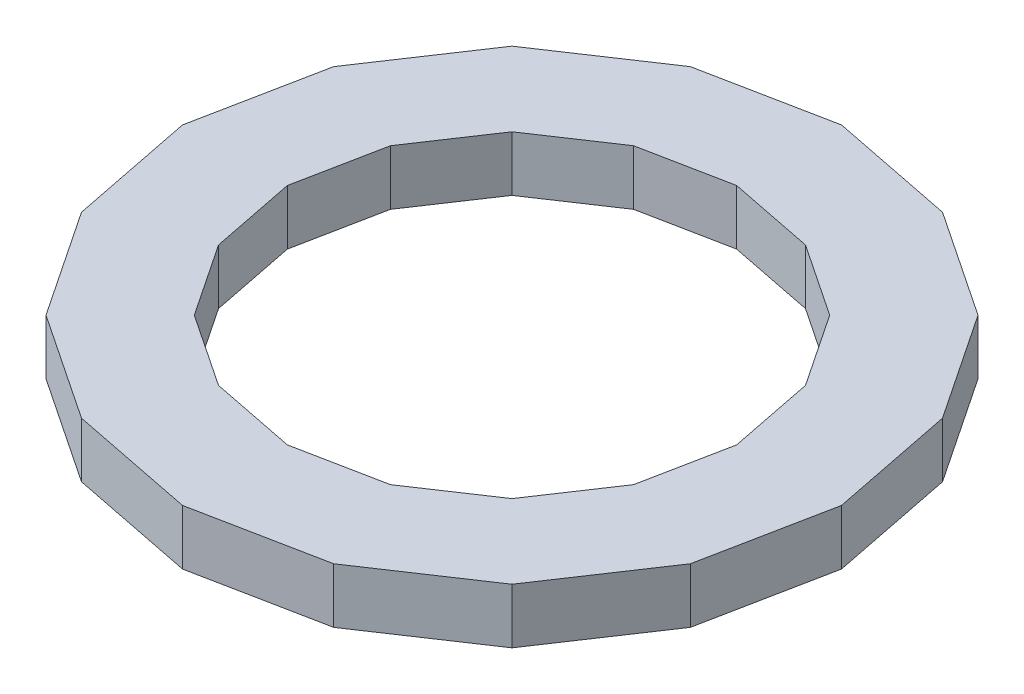
ISO-10303-21;
HEADER;
FILE_DESCRIPTION(('STEP AP214'),'2;1');
FILE_NAME('part.step','',(''),(''),'','','');
FILE_SCHEMA(('AUTOMOTIVE_DESIGN { 1 0 10303 214 1 1 1 1 }'));
ENDSEC;
DATA;
#1=APPLICATION_CONTEXT('core data for automotive mechanical design processes');
#2=APPLICATION_PROTOCOL_DEFINITION('international standard','automotive_design',2000,#1);
#3=PRODUCT_CONTEXT('',#1,'mechanical');
#4=PRODUCT('Part','Part','',(#3));
#5=PRODUCT_RELATED_PRODUCT_CATEGORY('part','',(#4));
#6=PRODUCT_DEFINITION_FORMATION('','',#4);
#7=PRODUCT_DEFINITION_CONTEXT('part definition',#1,'design');
#8=PRODUCT_DEFINITION('design','',#6,#7);
#9=PRODUCT_DEFINITION_SHAPE('','',#8);
#10=(LENGTH_UNIT() NAMED_UNIT(*) SI_UNIT(.MILLI.,.METRE.));
#11=(NAMED_UNIT(*) PLANE_ANGLE_UNIT() SI_UNIT($,.RADIAN.));
#12=(NAMED_UNIT(*) SI_UNIT($,.STERADIAN.) SOLID_ANGLE_UNIT());
#13=UNCERTAINTY_MEASURE_WITH_UNIT(LENGTH_MEASURE(1.E-05),#10,'distance_accuracy_value','');
#14=(GEOMETRIC_REPRESENTATION_CONTEXT(3) GLOBAL_UNCERTAINTY_ASSIGNED_CONTEXT((#13)) GLOBAL_UNIT_ASSIGNED_CONTEXT((#10,
#11,#12)) REPRESENTATION_CONTEXT('',''));
#15=CARTESIAN_POINT('',(0.,0.,0.));
#16=DIRECTION('',(0.,0.,1.));
#17=DIRECTION('',(1.,0.,0.));
#18=AXIS2_PLACEMENT_3D('',#15,#16,#17);
#19=CARTESIAN_POINT('',(0.,19.05,0.));
#20=DIRECTION('',(0.,1.,0.));
#21=DIRECTION('',(0.,0.,1.));
#22=AXIS2_PLACEMENT_3D('',#19,#20,#21);
#23=PLANE('',#22);
#24=DIRECTION('',(0.195090322016117,0.,-0.980785280403233));
#25=VECTOR('',#24,1.);
#26=CARTESIAN_POINT('',(105.249826838494,19.05,43.5959057139223));
#27=LINE('',#26,#25);
#28=CARTESIAN_POINT('',(105.249826838494,19.05,43.5959057139223));
#29=VERTEX_POINT('',#28);
#30=CARTESIAN_POINT('',(113.92159165211,19.05,-1.32185447222563E-12));
#31=VERTEX_POINT('',#30);
#32=EDGE_CURVE('E374',#29,#31,#27,.T.);
#33=ORIENTED_EDGE('',*,*,#32,.T.);
#34=DIRECTION('',(-0.19509032201614,0.,-0.980785280403228));
#35=VECTOR('',#34,1.);
#36=CARTESIAN_POINT('',(113.92159165211,19.05,-1.32185447222563E-12));
#37=LINE('',#36,#35);
#38=CARTESIAN_POINT('',(105.249826838493,19.05,-43.5959057139248));
#39=VERTEX_POINT('',#38);
#40=EDGE_CURVE('E377',#31,#39,#37,.T.);
#41=ORIENTED_EDGE('',*,*,#40,.T.);
#42=DIRECTION('',(-0.555570233019612,0.,-0.831469612302539));
#43=VECTOR('',#42,1.);
#44=CARTESIAN_POINT('',(105.249826838493,19.05,-43.5959057139248));
#45=LINE('',#44,#43);
#46=CARTESIAN_POINT('',(80.5547299807707,19.05,-80.5547299807727));
#47=VERTEX_POINT('',#46);
#48=EDGE_CURVE('E381',#39,#47,#45,.T.);
#49=ORIENTED_EDGE('',*,*,#48,.T.);
#50=DIRECTION('',(-0.831469612302552,0.,-0.555570233019593));
#51=VECTOR('',#50,1.);
#52=CARTESIAN_POINT('',(80.5547299807707,19.05,-80.5547299807727));
#53=LINE('',#52,#51);
#54=CARTESIAN_POINT('',(43.5959057139224,19.05,-105.249826838494));
#55=VERTEX_POINT('',#54);
#56=EDGE_CURVE('E384',#47,#55,#53,.T.);
#57=ORIENTED_EDGE('',*,*,#56,.T.);
#58=DIRECTION('',(-0.980785280403233,0.,-0.195090322016117));
#59=VECTOR('',#58,1.);
#60=CARTESIAN_POINT('',(43.5959057139224,19.05,-105.249826838494));
#61=LINE('',#60,#59);
#62=CARTESIAN_POINT('',(-1.27781877703598E-12,19.05,-113.92159165211));
#63=VERTEX_POINT('',#62);
#64=EDGE_CURVE('E386',#55,#63,#61,.T.);
#65=ORIENTED_EDGE('',*,*,#64,.T.);
#66=DIRECTION('',(-0.980785280403228,0.,0.19509032201614));
#67=VECTOR('',#66,1.);
#68=CARTESIAN_POINT('',(-1.27781877703598E-12,19.05,-113.92159165211));
#69=LINE('',#68,#67);
#70=CARTESIAN_POINT('',(-43.5959057139248,19.05,-105.249826838493));
#71=VERTEX_POINT('',#70);
#72=EDGE_CURVE('E388',#63,#71,#69,.T.);
#73=ORIENTED_EDGE('',*,*,#72,.T.);
#74=DIRECTION('',(-0.831469612302539,0.,0.555570233019612));
#75=VECTOR('',#74,1.);
#76=CARTESIAN_POINT('',(-43.5959057139248,19.05,-105.249826838493));
#77=LINE('',#76,#75);
#78=CARTESIAN_POINT('',(-80.5547299807727,19.05,-80.5547299807707));
#79=VERTEX_POINT('',#78);
#80=EDGE_CURVE('E390',#71,#79,#77,.T.);
#81=ORIENTED_EDGE('',*,*,#80,.T.);
#82=DIRECTION('',(-0.555570233019592,0.,0.831469612302552));
#83=VECTOR('',#82,1.);
#84=CARTESIAN_POINT('',(-80.5547299807727,19.05,-80.5547299807707));
#85=LINE('',#84,#83);
#86=CARTESIAN_POINT('',(-105.249826838494,19.05,-43.5959057139224));
#87=VERTEX_POINT('',#86);
#88=EDGE_CURVE('E392',#79,#87,#85,.T.);
#89=ORIENTED_EDGE('',*,*,#88,.T.);
#90=DIRECTION('',(-0.195090322016117,0.,0.980785280403233));
#91=VECTOR('',#90,1.);
#92=CARTESIAN_POINT('',(-105.249826838494,19.05,-43.5959057139224));
#93=LINE('',#92,#91);
#94=CARTESIAN_POINT('',(-113.92159165211,19.05,1.33699405385507E-12));
#95=VERTEX_POINT('',#94);
#96=EDGE_CURVE('E394',#87,#95,#93,.T.);
#97=ORIENTED_EDGE('',*,*,#96,.T.);
#98=DIRECTION('',(0.195090322016139,0.,0.980785280403228));
#99=VECTOR('',#98,1.);
#100=CARTESIAN_POINT('',(-113.92159165211,19.05,1.33699405385507E-12));
#101=LINE('',#100,#99);
#102=CARTESIAN_POINT('',(-105.249826838493,19.05,43.5959057139248));
#103=VERTEX_POINT('',#102);
#104=EDGE_CURVE('E396',#95,#103,#101,.T.);
#105=ORIENTED_EDGE('',*,*,#104,.T.);
#106=DIRECTION('',(0.555570233019612,0.,0.831469612302538));
#107=VECTOR('',#106,1.);
#108=CARTESIAN_POINT('',(-105.249826838493,19.05,43.5959057139248));
#109=LINE('',#108,#107);
#110=CARTESIAN_POINT('',(-80.5547299807708,19.05,80.5547299807726));
#111=VERTEX_POINT('',#110);
#112=EDGE_CURVE('E398',#103,#111,#109,.T.);
#113=ORIENTED_EDGE('',*,*,#112,.T.);
#114=DIRECTION('',(0.831469612302552,0.,0.555570233019592));
#115=VECTOR('',#114,1.);
#116=CARTESIAN_POINT('',(-80.5547299807708,19.05,80.5547299807726));
#117=LINE('',#116,#115);
#118=CARTESIAN_POINT('',(-43.5959057139224,19.05,105.249826838494));
#119=VERTEX_POINT('',#118);
#120=EDGE_CURVE('E400',#111,#119,#117,.T.);
#121=ORIENTED_EDGE('',*,*,#120,.T.);
#122=DIRECTION('',(0.980785280403233,0.,0.195090322016117));
#123=VECTOR('',#122,1.);
#124=CARTESIAN_POINT('',(-43.5959057139224,19.05,105.249826838494));
#125=LINE('',#124,#123);
#126=CARTESIAN_POINT('',(1.29327015394909E-12,19.05,113.92159165211));
#127=VERTEX_POINT('',#126);
#128=EDGE_CURVE('E402',#119,#127,#125,.T.);
#129=ORIENTED_EDGE('',*,*,#128,.T.);
#130=DIRECTION('',(0.980785280403228,0.,-0.195090322016139));
#131=VECTOR('',#130,1.);
#132=CARTESIAN_POINT('',(1.29327015394909E-12,19.05,113.92159165211));
#133=LINE('',#132,#131);
#134=CARTESIAN_POINT('',(43.5959057139248,19.05,105.249826838493));
#135=VERTEX_POINT('',#134);
#136=EDGE_CURVE('E404',#127,#135,#133,.T.);
#137=ORIENTED_EDGE('',*,*,#136,.T.);
#138=DIRECTION('',(0.831469612302539,0.,-0.555570233019612));
#139=VECTOR('',#138,1.);
#140=CARTESIAN_POINT('',(43.5959057139248,19.05,105.249826838493));
#141=LINE('',#140,#139);
#142=CARTESIAN_POINT('',(80.5547299807727,19.05,80.5547299807708));
#143=VERTEX_POINT('',#142);
#144=EDGE_CURVE('E406',#135,#143,#141,.T.);
#145=ORIENTED_EDGE('',*,*,#144,.T.);
#146=DIRECTION('',(0.555570233019593,0.,-0.831469612302552));
#147=VECTOR('',#146,1.);
#148=CARTESIAN_POINT('',(80.5547299807727,19.05,80.5547299807708));
#149=LINE('',#148,#147);
#150=EDGE_CURVE('E409',#143,#29,#149,.T.);
#151=ORIENTED_EDGE('',*,*,#150,.T.);
#152=EDGE_LOOP('',(#33,#41,#49,#57,#65,#73,#81,#89,#97,#105,#113,#121,#129,#137,#145,#151));
#153=FACE_BOUND('',#152,.T.);
#154=DIRECTION('',(-0.19509032201614,0.,-0.980785280403228));
#155=VECTOR('',#154,1.);
#156=CARTESIAN_POINT('',(77.6649300662221,19.05,-9.36572098531E-13));
#157=LINE('',#156,#155);
#158=CARTESIAN_POINT('',(77.6649300662221,19.05,-9.36572098531E-13));
#159=VERTEX_POINT('',#158);
#160=CARTESIAN_POINT('',(71.7530392821027,19.05,-29.7210820121374));
#161=VERTEX_POINT('',#160);
#162=EDGE_CURVE('E252',#159,#161,#157,.T.);
#163=ORIENTED_EDGE('',*,*,#162,.F.);
#164=DIRECTION('',(0.195090322016117,0.,-0.980785280403233));
#165=VECTOR('',#164,1.);
#166=CARTESIAN_POINT('',(71.7530392821035,19.05,29.7210820121357));
#167=LINE('',#166,#165);
#168=CARTESIAN_POINT('',(71.7530392821035,19.05,29.7210820121357));
#169=VERTEX_POINT('',#168);
#170=EDGE_CURVE('E244',#169,#159,#167,.T.);
#171=ORIENTED_EDGE('',*,*,#170,.F.);
#172=DIRECTION('',(0.555570233019592,0.,-0.831469612302552));
#173=VECTOR('',#172,1.);
#174=CARTESIAN_POINT('',(54.9173987102053,19.05,54.917398710204));
#175=LINE('',#174,#173);
#176=CARTESIAN_POINT('',(54.9173987102053,19.05,54.917398710204));
#177=VERTEX_POINT('',#176);
#178=EDGE_CURVE('E299',#177,#169,#175,.T.);
#179=ORIENTED_EDGE('',*,*,#178,.F.);
#180=DIRECTION('',(0.831469612302539,0.,-0.555570233019612));
#181=VECTOR('',#180,1.);
#182=CARTESIAN_POINT('',(29.7210820121374,19.05,71.7530392821027));
#183=LINE('',#182,#181);
#184=CARTESIAN_POINT('',(29.7210820121374,19.05,71.7530392821027));
#185=VERTEX_POINT('',#184);
#186=EDGE_CURVE('E296',#185,#177,#183,.T.);
#187=ORIENTED_EDGE('',*,*,#186,.F.);
#188=DIRECTION('',(0.980785280403228,0.,-0.19509032201614));
#189=VECTOR('',#188,1.);
#190=CARTESIAN_POINT('',(9.43866372589776E-13,19.05,77.6649300662221));
#191=LINE('',#190,#189);
#192=CARTESIAN_POINT('',(9.43866372589776E-13,19.05,77.6649300662221));
#193=VERTEX_POINT('',#192);
#194=EDGE_CURVE('E294',#193,#185,#191,.T.);
#195=ORIENTED_EDGE('',*,*,#194,.F.);
#196=DIRECTION('',(0.980785280403233,0.,0.195090322016117));
#197=VECTOR('',#196,1.);
#198=CARTESIAN_POINT('',(-29.7210820121357,19.05,71.7530392821034));
#199=LINE('',#198,#197);
#200=CARTESIAN_POINT('',(-29.7210820121357,19.05,71.7530392821034));
#201=VERTEX_POINT('',#200);
#202=EDGE_CURVE('E292',#201,#193,#199,.T.);
#203=ORIENTED_EDGE('',*,*,#202,.F.);
#204=DIRECTION('',(0.831469612302552,0.,0.555570233019592));
#205=VECTOR('',#204,1.);
#206=CARTESIAN_POINT('',(-54.917398710204,19.05,54.9173987102053));
#207=LINE('',#206,#205);
#208=CARTESIAN_POINT('',(-54.917398710204,19.05,54.9173987102053));
#209=VERTEX_POINT('',#208);
#210=EDGE_CURVE('E290',#209,#201,#207,.T.);
#211=ORIENTED_EDGE('',*,*,#210,.F.);
#212=DIRECTION('',(0.555570233019612,0.,0.831469612302539));
#213=VECTOR('',#212,1.);
#214=CARTESIAN_POINT('',(-71.7530392821027,19.05,29.7210820121374));
#215=LINE('',#214,#213);
#216=CARTESIAN_POINT('',(-71.7530392821027,19.05,29.7210820121374));
#217=VERTEX_POINT('',#216);
#218=EDGE_CURVE('E288',#217,#209,#215,.T.);
#219=ORIENTED_EDGE('',*,*,#218,.F.);
#220=DIRECTION('',(0.19509032201614,0.,0.980785280403228));
#221=VECTOR('',#220,1.);
#222=CARTESIAN_POINT('',(-77.6649300662221,19.05,9.09178563594835E-13));
#223=LINE('',#222,#221);
#224=CARTESIAN_POINT('',(-77.6649300662221,19.05,9.09178563594835E-13));
#225=VERTEX_POINT('',#224);
#226=EDGE_CURVE('E286',#225,#217,#223,.T.);
#227=ORIENTED_EDGE('',*,*,#226,.F.);
#228=DIRECTION('',(-0.195090322016116,0.,0.980785280403233));
#229=VECTOR('',#228,1.);
#230=CARTESIAN_POINT('',(-71.7530392821034,19.05,-29.7210820121356));
#231=LINE('',#230,#229);
#232=CARTESIAN_POINT('',(-71.7530392821034,19.05,-29.7210820121356));
#233=VERTEX_POINT('',#232);
#234=EDGE_CURVE('E283',#233,#225,#231,.T.);
#235=ORIENTED_EDGE('',*,*,#234,.F.);
#236=DIRECTION('',(-0.555570233019592,0.,0.831469612302552));
#237=VECTOR('',#236,1.);
#238=CARTESIAN_POINT('',(-54.9173987102053,19.05,-54.9173987102039));
#239=LINE('',#238,#237);
#240=CARTESIAN_POINT('',(-54.9173987102053,19.05,-54.9173987102039));
#241=VERTEX_POINT('',#240);
#242=EDGE_CURVE('E281',#241,#233,#239,.T.);
#243=ORIENTED_EDGE('',*,*,#242,.F.);
#244=DIRECTION('',(-0.831469612302539,0.,0.555570233019612));
#245=VECTOR('',#244,1.);
#246=CARTESIAN_POINT('',(-29.7210820121374,19.05,-71.7530392821027));
#247=LINE('',#246,#245);
#248=CARTESIAN_POINT('',(-29.7210820121374,19.05,-71.7530392821027));
#249=VERTEX_POINT('',#248);
#250=EDGE_CURVE('E279',#249,#241,#247,.T.);
#251=ORIENTED_EDGE('',*,*,#250,.F.);
#252=DIRECTION('',(-0.980785280403228,0.,0.19509032201614));
#253=VECTOR('',#252,1.);
#254=CARTESIAN_POINT('',(-1.02736207928173E-12,19.05,-77.6649300662221));
#255=LINE('',#254,#253);
#256=CARTESIAN_POINT('',(-1.02736207928173E-12,19.05,-77.6649300662221));
#257=VERTEX_POINT('',#256);
#258=EDGE_CURVE('E277',#257,#249,#255,.T.);
#259=ORIENTED_EDGE('',*,*,#258,.F.);
#260=DIRECTION('',(-0.980785280403233,0.,-0.195090322016117));
#261=VECTOR('',#260,1.);
#262=CARTESIAN_POINT('',(29.7210820121358,19.05,-71.7530392821033));
#263=LINE('',#262,#261);
#264=CARTESIAN_POINT('',(29.7210820121358,19.05,-71.7530392821033));
#265=VERTEX_POINT('',#264);
#266=EDGE_CURVE('E275',#265,#257,#263,.T.);
#267=ORIENTED_EDGE('',*,*,#266,.F.);
#268=DIRECTION('',(-0.831469612302552,0.,-0.555570233019592));
#269=VECTOR('',#268,1.);
#270=CARTESIAN_POINT('',(54.917398710204,19.05,-54.9173987102053));
#271=LINE('',#270,#269);
#272=CARTESIAN_POINT('',(54.917398710204,19.05,-54.9173987102053));
#273=VERTEX_POINT('',#272);
#274=EDGE_CURVE('E271',#273,#265,#271,.T.);
#275=ORIENTED_EDGE('',*,*,#274,.F.);
#276=DIRECTION('',(-0.555570233019612,0.,-0.831469612302539));
#277=VECTOR('',#276,1.);
#278=CARTESIAN_POINT('',(71.7530392821027,19.05,-29.7210820121374));
#279=LINE('',#278,#277);
#280=EDGE_CURVE('E265',#161,#273,#279,.T.);
#281=ORIENTED_EDGE('',*,*,#280,.F.);
#282=EDGE_LOOP('',(#163,#171,#179,#187,#195,#203,#211,#219,#227,#235,#243,#251,#259,#267,#275,#281));
#283=FACE_BOUND('',#282,.T.);
#284=ADVANCED_FACE('F35',(#153,#283),#23,.T.);
#285=CARTESIAN_POINT('',(0.,0.,0.));
#286=DIRECTION('',(0.,1.,0.));
#287=DIRECTION('',(0.,0.,1.));
#288=AXIS2_PLACEMENT_3D('',#285,#286,#287);
#289=PLANE('',#288);
#290=DIRECTION('',(0.195090322016117,0.,-0.980785280403233));
#291=VECTOR('',#290,1.);
#292=CARTESIAN_POINT('',(105.249826838494,0.,43.5959057139223));
#293=LINE('',#292,#291);
#294=CARTESIAN_POINT('',(105.249826838494,0.,43.5959057139223));
#295=VERTEX_POINT('',#294);
#296=CARTESIAN_POINT('',(113.92159165211,0.,-1.32185447222563E-12));
#297=VERTEX_POINT('',#296);
#298=EDGE_CURVE('E260',#295,#297,#293,.T.);
#299=ORIENTED_EDGE('',*,*,#298,.F.);
#300=DIRECTION('',(0.555570233019593,0.,-0.831469612302552));
#301=VECTOR('',#300,1.);
#302=CARTESIAN_POINT('',(80.5547299807727,0.,80.5547299807708));
#303=LINE('',#302,#301);
#304=CARTESIAN_POINT('',(80.5547299807727,0.,80.5547299807708));
#305=VERTEX_POINT('',#304);
#306=EDGE_CURVE('E378',#305,#295,#303,.T.);
#307=ORIENTED_EDGE('',*,*,#306,.F.);
#308=DIRECTION('',(0.831469612302539,0.,-0.555570233019612));
#309=VECTOR('',#308,1.);
#310=CARTESIAN_POINT('',(43.5959057139248,0.,105.249826838493));
#311=LINE('',#310,#309);
#312=CARTESIAN_POINT('',(43.5959057139248,0.,105.249826838493));
#313=VERTEX_POINT('',#312);
#314=EDGE_CURVE('E442',#313,#305,#311,.T.);
#315=ORIENTED_EDGE('',*,*,#314,.F.);
#316=DIRECTION('',(0.980785280403228,0.,-0.195090322016139));
#317=VECTOR('',#316,1.);
#318=CARTESIAN_POINT('',(1.29327015394909E-12,0.,113.92159165211));
#319=LINE('',#318,#317);
#320=CARTESIAN_POINT('',(1.29327015394909E-12,0.,113.92159165211));
#321=VERTEX_POINT('',#320);
#322=EDGE_CURVE('E440',#321,#313,#319,.T.);
#323=ORIENTED_EDGE('',*,*,#322,.F.);
#324=DIRECTION('',(0.980785280403233,0.,0.195090322016117));
#325=VECTOR('',#324,1.);
#326=CARTESIAN_POINT('',(-43.5959057139224,0.,105.249826838494));
#327=LINE('',#326,#325);
#328=CARTESIAN_POINT('',(-43.5959057139224,0.,105.249826838494));
#329=VERTEX_POINT('',#328);
#330=EDGE_CURVE('E437',#329,#321,#327,.T.);
#331=ORIENTED_EDGE('',*,*,#330,.F.);
#332=DIRECTION('',(0.831469612302552,0.,0.555570233019592));
#333=VECTOR('',#332,1.);
#334=CARTESIAN_POINT('',(-80.5547299807708,0.,80.5547299807726));
#335=LINE('',#334,#333);
#336=CARTESIAN_POINT('',(-80.5547299807708,0.,80.5547299807726));
#337=VERTEX_POINT('',#336);
#338=EDGE_CURVE('E434',#337,#329,#335,.T.);
#339=ORIENTED_EDGE('',*,*,#338,.F.);
#340=DIRECTION('',(0.555570233019612,0.,0.831469612302538));
#341=VECTOR('',#340,1.);
#342=CARTESIAN_POINT('',(-105.249826838493,0.,43.5959057139248));
#343=LINE('',#342,#341);
#344=CARTESIAN_POINT('',(-105.249826838493,0.,43.5959057139248));
#345=VERTEX_POINT('',#344);
#346=EDGE_CURVE('E432',#345,#337,#343,.T.);
#347=ORIENTED_EDGE('',*,*,#346,.F.);
#348=DIRECTION('',(0.195090322016139,0.,0.980785280403228));
#349=VECTOR('',#348,1.);
#350=CARTESIAN_POINT('',(-113.92159165211,0.,1.33699405385507E-12));
#351=LINE('',#350,#349);
#352=CARTESIAN_POINT('',(-113.92159165211,0.,1.33699405385507E-12));
#353=VERTEX_POINT('',#352);
#354=EDGE_CURVE('E430',#353,#345,#351,.T.);
#355=ORIENTED_EDGE('',*,*,#354,.F.);
#356=DIRECTION('',(-0.195090322016117,0.,0.980785280403233));
#357=VECTOR('',#356,1.);
#358=CARTESIAN_POINT('',(-105.249826838494,0.,-43.5959057139224));
#359=LINE('',#358,#357);
#360=CARTESIAN_POINT('',(-105.249826838494,0.,-43.5959057139224));
#361=VERTEX_POINT('',#360);
#362=EDGE_CURVE('E428',#361,#353,#359,.T.);
#363=ORIENTED_EDGE('',*,*,#362,.F.);
#364=DIRECTION('',(-0.555570233019592,0.,0.831469612302552));
#365=VECTOR('',#364,1.);
#366=CARTESIAN_POINT('',(-80.5547299807727,0.,-80.5547299807707));
#367=LINE('',#366,#365);
#368=CARTESIAN_POINT('',(-80.5547299807727,0.,-80.5547299807707));
#369=VERTEX_POINT('',#368);
#370=EDGE_CURVE('E426',#369,#361,#367,.T.);
#371=ORIENTED_EDGE('',*,*,#370,.F.);
#372=DIRECTION('',(-0.831469612302539,0.,0.555570233019612));
#373=VECTOR('',#372,1.);
#374=CARTESIAN_POINT('',(-43.5959057139248,0.,-105.249826838493));
#375=LINE('',#374,#373);
#376=CARTESIAN_POINT('',(-43.5959057139248,0.,-105.249826838493));
#377=VERTEX_POINT('',#376);
#378=EDGE_CURVE('E424',#377,#369,#375,.T.);
#379=ORIENTED_EDGE('',*,*,#378,.F.);
#380=DIRECTION('',(-0.980785280403228,0.,0.19509032201614));
#381=VECTOR('',#380,1.);
#382=CARTESIAN_POINT('',(-1.27781877703598E-12,0.,-113.92159165211));
#383=LINE('',#382,#381);
#384=CARTESIAN_POINT('',(-1.27781877703598E-12,0.,-113.92159165211));
#385=VERTEX_POINT('',#384);
#386=EDGE_CURVE('E422',#385,#377,#383,.T.);
#387=ORIENTED_EDGE('',*,*,#386,.F.);
#388=DIRECTION('',(-0.980785280403233,0.,-0.195090322016117));
#389=VECTOR('',#388,1.);
#390=CARTESIAN_POINT('',(43.5959057139224,0.,-105.249826838494));
#391=LINE('',#390,#389);
#392=CARTESIAN_POINT('',(43.5959057139224,0.,-105.249826838494));
#393=VERTEX_POINT('',#392);
#394=EDGE_CURVE('E420',#393,#385,#391,.T.);
#395=ORIENTED_EDGE('',*,*,#394,.F.);
#396=DIRECTION('',(-0.831469612302552,0.,-0.555570233019593));
#397=VECTOR('',#396,1.);
#398=CARTESIAN_POINT('',(80.5547299807707,0.,-80.5547299807727));
#399=LINE('',#398,#397);
#400=CARTESIAN_POINT('',(80.5547299807707,0.,-80.5547299807727));
#401=VERTEX_POINT('',#400);
#402=EDGE_CURVE('E418',#401,#393,#399,.T.);
#403=ORIENTED_EDGE('',*,*,#402,.F.);
#404=DIRECTION('',(-0.555570233019612,0.,-0.831469612302539));
#405=VECTOR('',#404,1.);
#406=CARTESIAN_POINT('',(105.249826838493,0.,-43.5959057139248));
#407=LINE('',#406,#405);
#408=CARTESIAN_POINT('',(105.249826838493,0.,-43.5959057139248));
#409=VERTEX_POINT('',#408);
#410=EDGE_CURVE('E416',#409,#401,#407,.T.);
#411=ORIENTED_EDGE('',*,*,#410,.F.);
#412=DIRECTION('',(-0.19509032201614,0.,-0.980785280403228));
#413=VECTOR('',#412,1.);
#414=CARTESIAN_POINT('',(113.92159165211,0.,-1.32185447222563E-12));
#415=LINE('',#414,#413);
#416=EDGE_CURVE('E414',#297,#409,#415,.T.);
#417=ORIENTED_EDGE('',*,*,#416,.F.);
#418=EDGE_LOOP('',(#299,#307,#315,#323,#331,#339,#347,#355,#363,#371,#379,#387,#395,#403,#411,#417));
#419=FACE_BOUND('',#418,.T.);
#420=DIRECTION('',(0.195090322016117,0.,-0.980785280403233));
#421=VECTOR('',#420,1.);
#422=CARTESIAN_POINT('',(71.7530392821035,0.,29.7210820121357));
#423=LINE('',#422,#421);
#424=CARTESIAN_POINT('',(71.7530392821035,0.,29.7210820121357));
#425=VERTEX_POINT('',#424);
#426=CARTESIAN_POINT('',(77.6649300662221,0.,-9.36572098531E-13));
#427=VERTEX_POINT('',#426);
#428=EDGE_CURVE('E58',#425,#427,#423,.T.);
#429=ORIENTED_EDGE('',*,*,#428,.T.);
#430=DIRECTION('',(-0.19509032201614,0.,-0.980785280403228));
#431=VECTOR('',#430,1.);
#432=CARTESIAN_POINT('',(77.6649300662221,0.,-9.36572098531E-13));
#433=LINE('',#432,#431);
#434=CARTESIAN_POINT('',(71.7530392821027,0.,-29.7210820121374));
#435=VERTEX_POINT('',#434);
#436=EDGE_CURVE('E259',#427,#435,#433,.T.);
#437=ORIENTED_EDGE('',*,*,#436,.T.);
#438=DIRECTION('',(-0.555570233019612,0.,-0.831469612302539));
#439=VECTOR('',#438,1.);
#440=CARTESIAN_POINT('',(71.7530392821027,0.,-29.7210820121374));
#441=LINE('',#440,#439);
#442=CARTESIAN_POINT('',(54.917398710204,0.,-54.9173987102053));
#443=VERTEX_POINT('',#442);
#444=EDGE_CURVE('E303',#435,#443,#441,.T.);
#445=ORIENTED_EDGE('',*,*,#444,.T.);
#446=DIRECTION('',(-0.831469612302552,0.,-0.555570233019592));
#447=VECTOR('',#446,1.);
#448=CARTESIAN_POINT('',(54.917398710204,0.,-54.9173987102053));
#449=LINE('',#448,#447);
#450=CARTESIAN_POINT('',(29.7210820121358,0.,-71.7530392821033));
#451=VERTEX_POINT('',#450);
#452=EDGE_CURVE('E306',#443,#451,#449,.T.);
#453=ORIENTED_EDGE('',*,*,#452,.T.);
#454=DIRECTION('',(-0.980785280403233,0.,-0.195090322016117));
#455=VECTOR('',#454,1.);
#456=CARTESIAN_POINT('',(29.7210820121358,0.,-71.7530392821033));
#457=LINE('',#456,#455);
#458=CARTESIAN_POINT('',(-1.02736207928173E-12,0.,-77.6649300662221));
#459=VERTEX_POINT('',#458);
#460=EDGE_CURVE('E309',#451,#459,#457,.T.);
#461=ORIENTED_EDGE('',*,*,#460,.T.);
#462=DIRECTION('',(-0.980785280403228,0.,0.19509032201614));
#463=VECTOR('',#462,1.);
#464=CARTESIAN_POINT('',(-1.02736207928173E-12,0.,-77.6649300662221));
#465=LINE('',#464,#463);
#466=CARTESIAN_POINT('',(-29.7210820121374,0.,-71.7530392821027));
#467=VERTEX_POINT('',#466);
#468=EDGE_CURVE('E312',#459,#467,#465,.T.);
#469=ORIENTED_EDGE('',*,*,#468,.T.);
#470=DIRECTION('',(-0.831469612302539,0.,0.555570233019612));
#471=VECTOR('',#470,1.);
#472=CARTESIAN_POINT('',(-29.7210820121374,0.,-71.7530392821027));
#473=LINE('',#472,#471);
#474=CARTESIAN_POINT('',(-54.9173987102053,0.,-54.9173987102039));
#475=VERTEX_POINT('',#474);
#476=EDGE_CURVE('E315',#467,#475,#473,.T.);
#477=ORIENTED_EDGE('',*,*,#476,.T.);
#478=DIRECTION('',(-0.555570233019592,0.,0.831469612302552));
#479=VECTOR('',#478,1.);
#480=CARTESIAN_POINT('',(-54.9173987102053,0.,-54.9173987102039));
#481=LINE('',#480,#479);
#482=CARTESIAN_POINT('',(-71.7530392821034,0.,-29.7210820121356));
#483=VERTEX_POINT('',#482);
#484=EDGE_CURVE('E318',#475,#483,#481,.T.);
#485=ORIENTED_EDGE('',*,*,#484,.T.);
#486=DIRECTION('',(-0.195090322016116,0.,0.980785280403233));
#487=VECTOR('',#486,1.);
#488=CARTESIAN_POINT('',(-71.7530392821034,0.,-29.7210820121356));
#489=LINE('',#488,#487);
#490=CARTESIAN_POINT('',(-77.6649300662221,0.,9.09178563594835E-13));
#491=VERTEX_POINT('',#490);
#492=EDGE_CURVE('E321',#483,#491,#489,.T.);
#493=ORIENTED_EDGE('',*,*,#492,.T.);
#494=DIRECTION('',(0.19509032201614,0.,0.980785280403228));
#495=VECTOR('',#494,1.);
#496=CARTESIAN_POINT('',(-77.6649300662221,0.,9.09178563594835E-13));
#497=LINE('',#496,#495);
#498=CARTESIAN_POINT('',(-71.7530392821027,0.,29.7210820121374));
#499=VERTEX_POINT('',#498);
#500=EDGE_CURVE('E324',#491,#499,#497,.T.);
#501=ORIENTED_EDGE('',*,*,#500,.T.);
#502=DIRECTION('',(0.555570233019612,0.,0.831469612302539));
#503=VECTOR('',#502,1.);
#504=CARTESIAN_POINT('',(-71.7530392821027,0.,29.7210820121374));
#505=LINE('',#504,#503);
#506=CARTESIAN_POINT('',(-54.917398710204,0.,54.9173987102053));
#507=VERTEX_POINT('',#506);
#508=EDGE_CURVE('E327',#499,#507,#505,.T.);
#509=ORIENTED_EDGE('',*,*,#508,.T.);
#510=DIRECTION('',(0.831469612302552,0.,0.555570233019592));
#511=VECTOR('',#510,1.);
#512=CARTESIAN_POINT('',(-54.917398710204,0.,54.9173987102053));
#513=LINE('',#512,#511);
#514=CARTESIAN_POINT('',(-29.7210820121357,0.,71.7530392821034));
#515=VERTEX_POINT('',#514);
#516=EDGE_CURVE('E331',#507,#515,#513,.T.);
#517=ORIENTED_EDGE('',*,*,#516,.T.);
#518=DIRECTION('',(0.980785280403233,0.,0.195090322016117));
#519=VECTOR('',#518,1.);
#520=CARTESIAN_POINT('',(-29.7210820121357,0.,71.7530392821034));
#521=LINE('',#520,#519);
#522=CARTESIAN_POINT('',(9.43866372589776E-13,0.,77.6649300662221));
#523=VERTEX_POINT('',#522);
#524=EDGE_CURVE('E334',#515,#523,#521,.T.);
#525=ORIENTED_EDGE('',*,*,#524,.T.);
#526=DIRECTION('',(0.980785280403228,0.,-0.19509032201614));
#527=VECTOR('',#526,1.);
#528=CARTESIAN_POINT('',(9.43866372589776E-13,0.,77.6649300662221));
#529=LINE('',#528,#527);
#530=CARTESIAN_POINT('',(29.7210820121374,0.,71.7530392821027));
#531=VERTEX_POINT('',#530);
#532=EDGE_CURVE('E337',#523,#531,#529,.T.);
#533=ORIENTED_EDGE('',*,*,#532,.T.);
#534=DIRECTION('',(0.831469612302539,0.,-0.555570233019612));
#535=VECTOR('',#534,1.);
#536=CARTESIAN_POINT('',(29.7210820121374,0.,71.7530392821027));
#537=LINE('',#536,#535);
#538=CARTESIAN_POINT('',(54.9173987102053,0.,54.917398710204));
#539=VERTEX_POINT('',#538);
#540=EDGE_CURVE('E340',#531,#539,#537,.T.);
#541=ORIENTED_EDGE('',*,*,#540,.T.);
#542=DIRECTION('',(0.555570233019592,0.,-0.831469612302552));
#543=VECTOR('',#542,1.);
#544=CARTESIAN_POINT('',(54.9173987102053,0.,54.917398710204));
#545=LINE('',#544,#543);
#546=EDGE_CURVE('E253',#539,#425,#545,.T.);
#547=ORIENTED_EDGE('',*,*,#546,.T.);
#548=EDGE_LOOP('',(#429,#437,#445,#453,#461,#469,#477,#485,#493,#501,#509,#517,#525,#533,#541,#547));
#549=FACE_BOUND('',#548,.T.);
#550=ADVANCED_FACE('F501',(#419,#549),#289,.F.);
#551=CARTESIAN_POINT('',(105.249826838494,19.05,43.5959057139223));
#552=DIRECTION('',(-0.980785280403233,0.,-0.195090322016117));
#553=DIRECTION('',(-0.195090322016117,0.,0.980785280403233));
#554=AXIS2_PLACEMENT_3D('',#551,#552,#553);
#555=PLANE('',#554);
#556=ORIENTED_EDGE('',*,*,#298,.T.);
#557=DIRECTION('',(0.,-1.,0.));
#558=VECTOR('',#557,1.);
#559=CARTESIAN_POINT('',(113.92159165211,19.05,-1.32185447222563E-12));
#560=LINE('',#559,#558);
#561=EDGE_CURVE('E11',#31,#297,#560,.T.);
#562=ORIENTED_EDGE('',*,*,#561,.F.);
#563=ORIENTED_EDGE('',*,*,#32,.F.);
#564=DIRECTION('',(0.,-1.,0.));
#565=VECTOR('',#564,1.);
#566=CARTESIAN_POINT('',(105.249826838494,19.05,43.5959057139223));
#567=LINE('',#566,#565);
#568=EDGE_CURVE('E411',#29,#295,#567,.T.);
#569=ORIENTED_EDGE('',*,*,#568,.T.);
#570=EDGE_LOOP('',(#556,#562,#563,#569));
#571=FACE_BOUND('',#570,.T.);
#572=ADVANCED_FACE('F37',(#571),#555,.F.);
#573=CARTESIAN_POINT('',(113.92159165211,19.05,-1.32185447222563E-12));
#574=DIRECTION('',(-0.980785280403228,0.,0.19509032201614));
#575=DIRECTION('',(0.19509032201614,0.,0.980785280403228));
#576=AXIS2_PLACEMENT_3D('',#573,#574,#575);
#577=PLANE('',#576);
#578=ORIENTED_EDGE('',*,*,#416,.T.);
#579=DIRECTION('',(0.,-1.,0.));
#580=VECTOR('',#579,1.);
#581=CARTESIAN_POINT('',(105.249826838493,19.05,-43.5959057139248));
#582=LINE('',#581,#580);
#583=EDGE_CURVE('E43',#39,#409,#582,.T.);
#584=ORIENTED_EDGE('',*,*,#583,.F.);
#585=ORIENTED_EDGE('',*,*,#40,.F.);
#586=ORIENTED_EDGE('',*,*,#561,.T.);
#587=EDGE_LOOP('',(#578,#584,#585,#586));
#588=FACE_BOUND('',#587,.T.);
#589=ADVANCED_FACE('F518',(#588),#577,.F.);
#590=CARTESIAN_POINT('',(105.249826838493,19.05,-43.5959057139248));
#591=DIRECTION('',(-0.831469612302539,0.,0.555570233019612));
#592=DIRECTION('',(0.555570233019612,0.,0.831469612302539));
#593=AXIS2_PLACEMENT_3D('',#590,#591,#592);
#594=PLANE('',#593);
#595=ORIENTED_EDGE('',*,*,#410,.T.);
#596=DIRECTION('',(0.,-1.,0.));
#597=VECTOR('',#596,1.);
#598=CARTESIAN_POINT('',(80.5547299807707,19.05,-80.5547299807727));
#599=LINE('',#598,#597);
#600=EDGE_CURVE('E486',#47,#401,#599,.T.);
#601=ORIENTED_EDGE('',*,*,#600,.F.);
#602=ORIENTED_EDGE('',*,*,#48,.F.);
#603=ORIENTED_EDGE('',*,*,#583,.T.);
#604=EDGE_LOOP('',(#595,#601,#602,#603));
#605=FACE_BOUND('',#604,.T.);
#606=ADVANCED_FACE('F495',(#605),#594,.F.);
#607=CARTESIAN_POINT('',(80.5547299807707,19.05,-80.5547299807727));
#608=DIRECTION('',(-0.555570233019592,0.,0.831469612302552));
#609=DIRECTION('',(0.831469612302552,0.,0.555570233019593));
#610=AXIS2_PLACEMENT_3D('',#607,#608,#609);
#611=PLANE('',#610);
#612=ORIENTED_EDGE('',*,*,#402,.T.);
#613=DIRECTION('',(0.,-1.,0.));
#614=VECTOR('',#613,1.);
#615=CARTESIAN_POINT('',(43.5959057139224,19.05,-105.249826838494));
#616=LINE('',#615,#614);
#617=EDGE_CURVE('E483',#55,#393,#616,.T.);
#618=ORIENTED_EDGE('',*,*,#617,.F.);
#619=ORIENTED_EDGE('',*,*,#56,.F.);
#620=ORIENTED_EDGE('',*,*,#600,.T.);
#621=EDGE_LOOP('',(#612,#618,#619,#620));
#622=FACE_BOUND('',#621,.T.);
#623=ADVANCED_FACE('F507',(#622),#611,.F.);
#624=CARTESIAN_POINT('',(43.5959057139224,19.05,-105.249826838494));
#625=DIRECTION('',(-0.195090322016117,0.,0.980785280403233));
#626=DIRECTION('',(0.980785280403233,0.,0.195090322016117));
#627=AXIS2_PLACEMENT_3D('',#624,#625,#626);
#628=PLANE('',#627);
#629=ORIENTED_EDGE('',*,*,#394,.T.);
#630=DIRECTION('',(0.,-1.,0.));
#631=VECTOR('',#630,1.);
#632=CARTESIAN_POINT('',(-1.27781877703598E-12,19.05,-113.92159165211));
#633=LINE('',#632,#631);
#634=EDGE_CURVE('E480',#63,#385,#633,.T.);
#635=ORIENTED_EDGE('',*,*,#634,.F.);
#636=ORIENTED_EDGE('',*,*,#64,.F.);
#637=ORIENTED_EDGE('',*,*,#617,.T.);
#638=EDGE_LOOP('',(#629,#635,#636,#637));
#639=FACE_BOUND('',#638,.T.);
#640=ADVANCED_FACE('F511',(#639),#628,.F.);
#641=CARTESIAN_POINT('',(-1.27781877703598E-12,19.05,-113.92159165211));
#642=DIRECTION('',(0.19509032201614,0.,0.980785280403228));
#643=DIRECTION('',(0.980785280403228,0.,-0.19509032201614));
#644=AXIS2_PLACEMENT_3D('',#641,#642,#643);
#645=PLANE('',#644);
#646=ORIENTED_EDGE('',*,*,#386,.T.);
#647=DIRECTION('',(0.,-1.,0.));
#648=VECTOR('',#647,1.);
#649=CARTESIAN_POINT('',(-43.5959057139248,19.05,-105.249826838493));
#650=LINE('',#649,#648);
#651=EDGE_CURVE('E476',#71,#377,#650,.T.);
#652=ORIENTED_EDGE('',*,*,#651,.F.);
#653=ORIENTED_EDGE('',*,*,#72,.F.);
#654=ORIENTED_EDGE('',*,*,#634,.T.);
#655=EDGE_LOOP('',(#646,#652,#653,#654));
#656=FACE_BOUND('',#655,.T.);
#657=ADVANCED_FACE('F571',(#656),#645,.F.);
#658=CARTESIAN_POINT('',(-43.5959057139248,19.05,-105.249826838493));
#659=DIRECTION('',(0.555570233019612,0.,0.831469612302539));
#660=DIRECTION('',(0.831469612302539,0.,-0.555570233019612));
#661=AXIS2_PLACEMENT_3D('',#658,#659,#660);
#662=PLANE('',#661);
#663=ORIENTED_EDGE('',*,*,#378,.T.);
#664=DIRECTION('',(0.,-1.,0.));
#665=VECTOR('',#664,1.);
#666=CARTESIAN_POINT('',(-80.5547299807727,19.05,-80.5547299807707));
#667=LINE('',#666,#665);
#668=EDGE_CURVE('E473',#79,#369,#667,.T.);
#669=ORIENTED_EDGE('',*,*,#668,.F.);
#670=ORIENTED_EDGE('',*,*,#80,.F.);
#671=ORIENTED_EDGE('',*,*,#651,.T.);
#672=EDGE_LOOP('',(#663,#669,#670,#671));
#673=FACE_BOUND('',#672,.T.);
#674=ADVANCED_FACE('F568',(#673),#662,.F.);
#675=CARTESIAN_POINT('',(-80.5547299807727,19.05,-80.5547299807707));
#676=DIRECTION('',(0.831469612302552,0.,0.555570233019592));
#677=DIRECTION('',(0.555570233019592,0.,-0.831469612302552));
#678=AXIS2_PLACEMENT_3D('',#675,#676,#677);
#679=PLANE('',#678);
#680=ORIENTED_EDGE('',*,*,#370,.T.);
#681=DIRECTION('',(0.,-1.,0.));
#682=VECTOR('',#681,1.);
#683=CARTESIAN_POINT('',(-105.249826838494,19.05,-43.5959057139224));
#684=LINE('',#683,#682);
#685=EDGE_CURVE('E470',#87,#361,#684,.T.);
#686=ORIENTED_EDGE('',*,*,#685,.F.);
#687=ORIENTED_EDGE('',*,*,#88,.F.);
#688=ORIENTED_EDGE('',*,*,#668,.T.);
#689=EDGE_LOOP('',(#680,#686,#687,#688));
#690=FACE_BOUND('',#689,.T.);
#691=ADVANCED_FACE('F564',(#690),#679,.F.);
#692=CARTESIAN_POINT('',(-105.249826838494,19.05,-43.5959057139224));
#693=DIRECTION('',(0.980785280403233,0.,0.195090322016117));
#694=DIRECTION('',(0.195090322016117,0.,-0.980785280403233));
#695=AXIS2_PLACEMENT_3D('',#692,#693,#694);
#696=PLANE('',#695);
#697=ORIENTED_EDGE('',*,*,#362,.T.);
#698=DIRECTION('',(0.,-1.,0.));
#699=VECTOR('',#698,1.);
#700=CARTESIAN_POINT('',(-113.92159165211,19.05,1.33699405385507E-12));
#701=LINE('',#700,#699);
#702=EDGE_CURVE('E467',#95,#353,#701,.T.);
#703=ORIENTED_EDGE('',*,*,#702,.F.);
#704=ORIENTED_EDGE('',*,*,#96,.F.);
#705=ORIENTED_EDGE('',*,*,#685,.T.);
#706=EDGE_LOOP('',(#697,#703,#704,#705));
#707=FACE_BOUND('',#706,.T.);
#708=ADVANCED_FACE('F560',(#707),#696,.F.);
#709=CARTESIAN_POINT('',(-113.92159165211,19.05,1.33699405385507E-12));
#710=DIRECTION('',(0.980785280403228,0.,-0.195090322016139));
#711=DIRECTION('',(-0.195090322016139,0.,-0.980785280403228));
#712=AXIS2_PLACEMENT_3D('',#709,#710,#711);
#713=PLANE('',#712);
#714=ORIENTED_EDGE('',*,*,#354,.T.);
#715=DIRECTION('',(0.,-1.,0.));
#716=VECTOR('',#715,1.);
#717=CARTESIAN_POINT('',(-105.249826838493,19.05,43.5959057139248));
#718=LINE('',#717,#716);
#719=EDGE_CURVE('E464',#103,#345,#718,.T.);
#720=ORIENTED_EDGE('',*,*,#719,.F.);
#721=ORIENTED_EDGE('',*,*,#104,.F.);
#722=ORIENTED_EDGE('',*,*,#702,.T.);
#723=EDGE_LOOP('',(#714,#720,#721,#722));
#724=FACE_BOUND('',#723,.T.);
#725=ADVANCED_FACE('F555',(#724),#713,.F.);
#726=CARTESIAN_POINT('',(-105.249826838493,19.05,43.5959057139248));
#727=DIRECTION('',(0.831469612302538,0.,-0.555570233019612));
#728=DIRECTION('',(-0.555570233019613,0.,-0.831469612302539));
#729=AXIS2_PLACEMENT_3D('',#726,#727,#728);
#730=PLANE('',#729);
#731=ORIENTED_EDGE('',*,*,#346,.T.);
#732=DIRECTION('',(0.,-1.,0.));
#733=VECTOR('',#732,1.);
#734=CARTESIAN_POINT('',(-80.5547299807708,19.05,80.5547299807726));
#735=LINE('',#734,#733);
#736=EDGE_CURVE('E461',#111,#337,#735,.T.);
#737=ORIENTED_EDGE('',*,*,#736,.F.);
#738=ORIENTED_EDGE('',*,*,#112,.F.);
#739=ORIENTED_EDGE('',*,*,#719,.T.);
#740=EDGE_LOOP('',(#731,#737,#738,#739));
#741=FACE_BOUND('',#740,.T.);
#742=ADVANCED_FACE('F549',(#741),#730,.F.);
#743=CARTESIAN_POINT('',(-80.5547299807708,19.05,80.5547299807726));
#744=DIRECTION('',(0.555570233019593,0.,-0.831469612302552));
#745=DIRECTION('',(-0.831469612302552,0.,-0.555570233019593));
#746=AXIS2_PLACEMENT_3D('',#743,#744,#745);
#747=PLANE('',#746);
#748=ORIENTED_EDGE('',*,*,#338,.T.);
#749=DIRECTION('',(0.,-1.,0.));
#750=VECTOR('',#749,1.);
#751=CARTESIAN_POINT('',(-43.5959057139224,19.05,105.249826838494));
#752=LINE('',#751,#750);
#753=EDGE_CURVE('E458',#119,#329,#752,.T.);
#754=ORIENTED_EDGE('',*,*,#753,.F.);
#755=ORIENTED_EDGE('',*,*,#120,.F.);
#756=ORIENTED_EDGE('',*,*,#736,.T.);
#757=EDGE_LOOP('',(#748,#754,#755,#756));
#758=FACE_BOUND('',#757,.T.);
#759=ADVANCED_FACE('F545',(#758),#747,.F.);
#760=CARTESIAN_POINT('',(-43.5959057139224,19.05,105.249826838494));
#761=DIRECTION('',(0.195090322016117,0.,-0.980785280403233));
#762=DIRECTION('',(-0.980785280403233,0.,-0.195090322016117));
#763=AXIS2_PLACEMENT_3D('',#760,#761,#762);
#764=PLANE('',#763);
#765=ORIENTED_EDGE('',*,*,#330,.T.);
#766=DIRECTION('',(0.,-1.,0.));
#767=VECTOR('',#766,1.);
#768=CARTESIAN_POINT('',(1.29327015394909E-12,19.05,113.92159165211));
#769=LINE('',#768,#767);
#770=EDGE_CURVE('E455',#127,#321,#769,.T.);
#771=ORIENTED_EDGE('',*,*,#770,.F.);
#772=ORIENTED_EDGE('',*,*,#128,.F.);
#773=ORIENTED_EDGE('',*,*,#753,.T.);
#774=EDGE_LOOP('',(#765,#771,#772,#773));
#775=FACE_BOUND('',#774,.T.);
#776=ADVANCED_FACE('F540',(#775),#764,.F.);
#777=CARTESIAN_POINT('',(1.29327015394909E-12,19.05,113.92159165211));
#778=DIRECTION('',(-0.195090322016139,0.,-0.980785280403228));
#779=DIRECTION('',(-0.980785280403228,0.,0.195090322016139));
#780=AXIS2_PLACEMENT_3D('',#777,#778,#779);
#781=PLANE('',#780);
#782=ORIENTED_EDGE('',*,*,#322,.T.);
#783=DIRECTION('',(0.,-1.,0.));
#784=VECTOR('',#783,1.);
#785=CARTESIAN_POINT('',(43.5959057139248,19.05,105.249826838493));
#786=LINE('',#785,#784);
#787=EDGE_CURVE('E452',#135,#313,#786,.T.);
#788=ORIENTED_EDGE('',*,*,#787,.F.);
#789=ORIENTED_EDGE('',*,*,#136,.F.);
#790=ORIENTED_EDGE('',*,*,#770,.T.);
#791=EDGE_LOOP('',(#782,#788,#789,#790));
#792=FACE_BOUND('',#791,.T.);
#793=ADVANCED_FACE('F534',(#792),#781,.F.);
#794=CARTESIAN_POINT('',(43.5959057139248,19.05,105.249826838493));
#795=DIRECTION('',(-0.555570233019612,0.,-0.831469612302539));
#796=DIRECTION('',(-0.831469612302539,0.,0.555570233019612));
#797=AXIS2_PLACEMENT_3D('',#794,#795,#796);
#798=PLANE('',#797);
#799=ORIENTED_EDGE('',*,*,#314,.T.);
#800=DIRECTION('',(0.,-1.,0.));
#801=VECTOR('',#800,1.);
#802=CARTESIAN_POINT('',(80.5547299807727,19.05,80.5547299807708));
#803=LINE('',#802,#801);
#804=EDGE_CURVE('E449',#143,#305,#803,.T.);
#805=ORIENTED_EDGE('',*,*,#804,.F.);
#806=ORIENTED_EDGE('',*,*,#144,.F.);
#807=ORIENTED_EDGE('',*,*,#787,.T.);
#808=EDGE_LOOP('',(#799,#805,#806,#807));
#809=FACE_BOUND('',#808,.T.);
#810=ADVANCED_FACE('F530',(#809),#798,.F.);
#811=CARTESIAN_POINT('',(80.5547299807727,19.05,80.5547299807708));
#812=DIRECTION('',(-0.831469612302552,0.,-0.555570233019593));
#813=DIRECTION('',(-0.555570233019593,0.,0.831469612302552));
#814=AXIS2_PLACEMENT_3D('',#811,#812,#813);
#815=PLANE('',#814);
#816=ORIENTED_EDGE('',*,*,#306,.T.);
#817=ORIENTED_EDGE('',*,*,#568,.F.);
#818=ORIENTED_EDGE('',*,*,#150,.F.);
#819=ORIENTED_EDGE('',*,*,#804,.T.);
#820=EDGE_LOOP('',(#816,#817,#818,#819));
#821=FACE_BOUND('',#820,.T.);
#822=ADVANCED_FACE('F525',(#821),#815,.F.);
#823=CARTESIAN_POINT('',(71.7530392821035,19.05,29.7210820121357));
#824=DIRECTION('',(-0.980785280403233,0.,-0.195090322016116));
#825=DIRECTION('',(-0.195090322016116,0.,0.980785280403233));
#826=AXIS2_PLACEMENT_3D('',#823,#824,#825);
#827=PLANE('',#826);
#828=ORIENTED_EDGE('',*,*,#428,.F.);
#829=DIRECTION('',(0.,-1.,0.));
#830=VECTOR('',#829,1.);
#831=CARTESIAN_POINT('',(71.7530392821035,19.05,29.7210820121357));
#832=LINE('',#831,#830);
#833=EDGE_CURVE('E248',#169,#425,#832,.T.);
#834=ORIENTED_EDGE('',*,*,#833,.F.);
#835=ORIENTED_EDGE('',*,*,#170,.T.);
#836=DIRECTION('',(0.,-1.,0.));
#837=VECTOR('',#836,1.);
#838=CARTESIAN_POINT('',(77.6649300662221,19.05,-9.36572098531E-13));
#839=LINE('',#838,#837);
#840=EDGE_CURVE('E247',#159,#427,#839,.T.);
#841=ORIENTED_EDGE('',*,*,#840,.T.);
#842=EDGE_LOOP('',(#828,#834,#835,#841));
#843=FACE_BOUND('',#842,.T.);
#844=ADVANCED_FACE('F246',(#843),#827,.T.);
#845=CARTESIAN_POINT('',(77.6649300662221,19.05,-9.36572098531E-13));
#846=DIRECTION('',(-0.980785280403228,0.,0.19509032201614));
#847=DIRECTION('',(0.19509032201614,0.,0.980785280403228));
#848=AXIS2_PLACEMENT_3D('',#845,#846,#847);
#849=PLANE('',#848);
#850=ORIENTED_EDGE('',*,*,#436,.F.);
#851=ORIENTED_EDGE('',*,*,#840,.F.);
#852=ORIENTED_EDGE('',*,*,#162,.T.);
#853=DIRECTION('',(0.,-1.,0.));
#854=VECTOR('',#853,1.);
#855=CARTESIAN_POINT('',(71.7530392821027,19.05,-29.7210820121374));
#856=LINE('',#855,#854);
#857=EDGE_CURVE('E261',#161,#435,#856,.T.);
#858=ORIENTED_EDGE('',*,*,#857,.T.);
#859=EDGE_LOOP('',(#850,#851,#852,#858));
#860=FACE_BOUND('',#859,.T.);
#861=ADVANCED_FACE('F256',(#860),#849,.T.);
#862=CARTESIAN_POINT('',(71.7530392821027,19.05,-29.7210820121374));
#863=DIRECTION('',(-0.831469612302539,0.,0.555570233019612));
#864=DIRECTION('',(0.555570233019612,0.,0.831469612302539));
#865=AXIS2_PLACEMENT_3D('',#862,#863,#864);
#866=PLANE('',#865);
#867=ORIENTED_EDGE('',*,*,#444,.F.);
#868=ORIENTED_EDGE('',*,*,#857,.F.);
#869=ORIENTED_EDGE('',*,*,#280,.T.);
#870=DIRECTION('',(0.,-1.,0.));
#871=VECTOR('',#870,1.);
#872=CARTESIAN_POINT('',(54.917398710204,19.05,-54.9173987102053));
#873=LINE('',#872,#871);
#874=EDGE_CURVE('E370',#273,#443,#873,.T.);
#875=ORIENTED_EDGE('',*,*,#874,.T.);
#876=EDGE_LOOP('',(#867,#868,#869,#875));
#877=FACE_BOUND('',#876,.T.);
#878=ADVANCED_FACE('F653',(#877),#866,.T.);
#879=CARTESIAN_POINT('',(54.917398710204,19.05,-54.9173987102053));
#880=DIRECTION('',(-0.555570233019592,0.,0.831469612302552));
#881=DIRECTION('',(0.831469612302552,0.,0.555570233019592));
#882=AXIS2_PLACEMENT_3D('',#879,#880,#881);
#883=PLANE('',#882);
#884=ORIENTED_EDGE('',*,*,#452,.F.);
#885=ORIENTED_EDGE('',*,*,#874,.F.);
#886=ORIENTED_EDGE('',*,*,#274,.T.);
#887=DIRECTION('',(0.,-1.,0.));
#888=VECTOR('',#887,1.);
#889=CARTESIAN_POINT('',(29.7210820121358,19.05,-71.7530392821033));
#890=LINE('',#889,#888);
#891=EDGE_CURVE('E368',#265,#451,#890,.T.);
#892=ORIENTED_EDGE('',*,*,#891,.T.);
#893=EDGE_LOOP('',(#884,#885,#886,#892));
#894=FACE_BOUND('',#893,.T.);
#895=ADVANCED_FACE('F659',(#894),#883,.T.);
#896=CARTESIAN_POINT('',(29.7210820121358,19.05,-71.7530392821033));
#897=DIRECTION('',(-0.195090322016117,0.,0.980785280403233));
#898=DIRECTION('',(0.980785280403233,0.,0.195090322016117));
#899=AXIS2_PLACEMENT_3D('',#896,#897,#898);
#900=PLANE('',#899);
#901=ORIENTED_EDGE('',*,*,#460,.F.);
#902=ORIENTED_EDGE('',*,*,#891,.F.);
#903=ORIENTED_EDGE('',*,*,#266,.T.);
#904=DIRECTION('',(0.,-1.,0.));
#905=VECTOR('',#904,1.);
#906=CARTESIAN_POINT('',(-1.02736207928173E-12,19.05,-77.6649300662221));
#907=LINE('',#906,#905);
#908=EDGE_CURVE('E366',#257,#459,#907,.T.);
#909=ORIENTED_EDGE('',*,*,#908,.T.);
#910=EDGE_LOOP('',(#901,#902,#903,#909));
#911=FACE_BOUND('',#910,.T.);
#912=ADVANCED_FACE('F667',(#911),#900,.T.);
#913=CARTESIAN_POINT('',(-1.02736207928173E-12,19.05,-77.6649300662221));
#914=DIRECTION('',(0.19509032201614,0.,0.980785280403228));
#915=DIRECTION('',(0.980785280403228,0.,-0.19509032201614));
#916=AXIS2_PLACEMENT_3D('',#913,#914,#915);
#917=PLANE('',#916);
#918=ORIENTED_EDGE('',*,*,#468,.F.);
#919=ORIENTED_EDGE('',*,*,#908,.F.);
#920=ORIENTED_EDGE('',*,*,#258,.T.);
#921=DIRECTION('',(0.,-1.,0.));
#922=VECTOR('',#921,1.);
#923=CARTESIAN_POINT('',(-29.7210820121374,19.05,-71.7530392821027));
#924=LINE('',#923,#922);
#925=EDGE_CURVE('E364',#249,#467,#924,.T.);
#926=ORIENTED_EDGE('',*,*,#925,.T.);
#927=EDGE_LOOP('',(#918,#919,#920,#926));
#928=FACE_BOUND('',#927,.T.);
#929=ADVANCED_FACE('F675',(#928),#917,.T.);
#930=CARTESIAN_POINT('',(-29.7210820121374,19.05,-71.7530392821027));
#931=DIRECTION('',(0.555570233019612,0.,0.831469612302539));
#932=DIRECTION('',(0.831469612302539,0.,-0.555570233019612));
#933=AXIS2_PLACEMENT_3D('',#930,#931,#932);
#934=PLANE('',#933);
#935=ORIENTED_EDGE('',*,*,#476,.F.);
#936=ORIENTED_EDGE('',*,*,#925,.F.);
#937=ORIENTED_EDGE('',*,*,#250,.T.);
#938=DIRECTION('',(0.,-1.,0.));
#939=VECTOR('',#938,1.);
#940=CARTESIAN_POINT('',(-54.9173987102053,19.05,-54.9173987102039));
#941=LINE('',#940,#939);
#942=EDGE_CURVE('E362',#241,#475,#941,.T.);
#943=ORIENTED_EDGE('',*,*,#942,.T.);
#944=EDGE_LOOP('',(#935,#936,#937,#943));
#945=FACE_BOUND('',#944,.T.);
#946=ADVANCED_FACE('F683',(#945),#934,.T.);
#947=CARTESIAN_POINT('',(-54.9173987102053,19.05,-54.9173987102039));
#948=DIRECTION('',(0.831469612302552,0.,0.555570233019592));
#949=DIRECTION('',(0.555570233019592,0.,-0.831469612302552));
#950=AXIS2_PLACEMENT_3D('',#947,#948,#949);
#951=PLANE('',#950);
#952=ORIENTED_EDGE('',*,*,#484,.F.);
#953=ORIENTED_EDGE('',*,*,#942,.F.);
#954=ORIENTED_EDGE('',*,*,#242,.T.);
#955=DIRECTION('',(0.,-1.,0.));
#956=VECTOR('',#955,1.);
#957=CARTESIAN_POINT('',(-71.7530392821034,19.05,-29.7210820121356));
#958=LINE('',#957,#956);
#959=EDGE_CURVE('E360',#233,#483,#958,.T.);
#960=ORIENTED_EDGE('',*,*,#959,.T.);
#961=EDGE_LOOP('',(#952,#953,#954,#960));
#962=FACE_BOUND('',#961,.T.);
#963=ADVANCED_FACE('F691',(#962),#951,.T.);
#964=CARTESIAN_POINT('',(-71.7530392821034,19.05,-29.7210820121356));
#965=DIRECTION('',(0.980785280403233,0.,0.195090322016116));
#966=DIRECTION('',(0.195090322016116,0.,-0.980785280403233));
#967=AXIS2_PLACEMENT_3D('',#964,#965,#966);
#968=PLANE('',#967);
#969=ORIENTED_EDGE('',*,*,#492,.F.);
#970=ORIENTED_EDGE('',*,*,#959,.F.);
#971=ORIENTED_EDGE('',*,*,#234,.T.);
#972=DIRECTION('',(0.,-1.,0.));
#973=VECTOR('',#972,1.);
#974=CARTESIAN_POINT('',(-77.6649300662221,19.05,9.09178563594835E-13));
#975=LINE('',#974,#973);
#976=EDGE_CURVE('E358',#225,#491,#975,.T.);
#977=ORIENTED_EDGE('',*,*,#976,.T.);
#978=EDGE_LOOP('',(#969,#970,#971,#977));
#979=FACE_BOUND('',#978,.T.);
#980=ADVANCED_FACE('F699',(#979),#968,.T.);
#981=CARTESIAN_POINT('',(-77.6649300662221,19.05,9.09178563594835E-13));
#982=DIRECTION('',(0.980785280403228,0.,-0.19509032201614));
#983=DIRECTION('',(-0.19509032201614,0.,-0.980785280403228));
#984=AXIS2_PLACEMENT_3D('',#981,#982,#983);
#985=PLANE('',#984);
#986=ORIENTED_EDGE('',*,*,#500,.F.);
#987=ORIENTED_EDGE('',*,*,#976,.F.);
#988=ORIENTED_EDGE('',*,*,#226,.T.);
#989=DIRECTION('',(0.,-1.,0.));
#990=VECTOR('',#989,1.);
#991=CARTESIAN_POINT('',(-71.7530392821027,19.05,29.7210820121374));
#992=LINE('',#991,#990);
#993=EDGE_CURVE('E356',#217,#499,#992,.T.);
#994=ORIENTED_EDGE('',*,*,#993,.T.);
#995=EDGE_LOOP('',(#986,#987,#988,#994));
#996=FACE_BOUND('',#995,.T.);
#997=ADVANCED_FACE('F707',(#996),#985,.T.);
#998=CARTESIAN_POINT('',(-71.7530392821027,19.05,29.7210820121374));
#999=DIRECTION('',(0.831469612302539,0.,-0.555570233019612));
#1000=DIRECTION('',(-0.555570233019612,0.,-0.831469612302539));
#1001=AXIS2_PLACEMENT_3D('',#998,#999,#1000);
#1002=PLANE('',#1001);
#1003=ORIENTED_EDGE('',*,*,#508,.F.);
#1004=ORIENTED_EDGE('',*,*,#993,.F.);
#1005=ORIENTED_EDGE('',*,*,#218,.T.);
#1006=DIRECTION('',(0.,-1.,0.));
#1007=VECTOR('',#1006,1.);
#1008=CARTESIAN_POINT('',(-54.917398710204,19.05,54.9173987102053));
#1009=LINE('',#1008,#1007);
#1010=EDGE_CURVE('E354',#209,#507,#1009,.T.);
#1011=ORIENTED_EDGE('',*,*,#1010,.T.);
#1012=EDGE_LOOP('',(#1003,#1004,#1005,#1011));
#1013=FACE_BOUND('',#1012,.T.);
#1014=ADVANCED_FACE('F715',(#1013),#1002,.T.);
#1015=CARTESIAN_POINT('',(-54.917398710204,19.05,54.9173987102053));
#1016=DIRECTION('',(0.555570233019592,0.,-0.831469612302552));
#1017=DIRECTION('',(-0.831469612302552,0.,-0.555570233019592));
#1018=AXIS2_PLACEMENT_3D('',#1015,#1016,#1017);
#1019=PLANE('',#1018);
#1020=ORIENTED_EDGE('',*,*,#516,.F.);
#1021=ORIENTED_EDGE('',*,*,#1010,.F.);
#1022=ORIENTED_EDGE('',*,*,#210,.T.);
#1023=DIRECTION('',(0.,-1.,0.));
#1024=VECTOR('',#1023,1.);
#1025=CARTESIAN_POINT('',(-29.7210820121357,19.05,71.7530392821034));
#1026=LINE('',#1025,#1024);
#1027=EDGE_CURVE('E352',#201,#515,#1026,.T.);
#1028=ORIENTED_EDGE('',*,*,#1027,.T.);
#1029=EDGE_LOOP('',(#1020,#1021,#1022,#1028));
#1030=FACE_BOUND('',#1029,.T.);
#1031=ADVANCED_FACE('F723',(#1030),#1019,.T.);
#1032=CARTESIAN_POINT('',(-29.7210820121357,19.05,71.7530392821034));
#1033=DIRECTION('',(0.195090322016117,0.,-0.980785280403233));
#1034=DIRECTION('',(-0.980785280403233,0.,-0.195090322016117));
#1035=AXIS2_PLACEMENT_3D('',#1032,#1033,#1034);
#1036=PLANE('',#1035);
#1037=ORIENTED_EDGE('',*,*,#524,.F.);
#1038=ORIENTED_EDGE('',*,*,#1027,.F.);
#1039=ORIENTED_EDGE('',*,*,#202,.T.);
#1040=DIRECTION('',(0.,-1.,0.));
#1041=VECTOR('',#1040,1.);
#1042=CARTESIAN_POINT('',(9.43866372589776E-13,19.05,77.6649300662221));
#1043=LINE('',#1042,#1041);
#1044=EDGE_CURVE('E350',#193,#523,#1043,.T.);
#1045=ORIENTED_EDGE('',*,*,#1044,.T.);
#1046=EDGE_LOOP('',(#1037,#1038,#1039,#1045));
#1047=FACE_BOUND('',#1046,.T.);
#1048=ADVANCED_FACE('F731',(#1047),#1036,.T.);
#1049=CARTESIAN_POINT('',(9.43866372589776E-13,19.05,77.6649300662221));
#1050=DIRECTION('',(-0.19509032201614,0.,-0.980785280403228));
#1051=DIRECTION('',(-0.980785280403228,0.,0.19509032201614));
#1052=AXIS2_PLACEMENT_3D('',#1049,#1050,#1051);
#1053=PLANE('',#1052);
#1054=ORIENTED_EDGE('',*,*,#532,.F.);
#1055=ORIENTED_EDGE('',*,*,#1044,.F.);
#1056=ORIENTED_EDGE('',*,*,#194,.T.);
#1057=DIRECTION('',(0.,-1.,0.));
#1058=VECTOR('',#1057,1.);
#1059=CARTESIAN_POINT('',(29.7210820121374,19.05,71.7530392821027));
#1060=LINE('',#1059,#1058);
#1061=EDGE_CURVE('E348',#185,#531,#1060,.T.);
#1062=ORIENTED_EDGE('',*,*,#1061,.T.);
#1063=EDGE_LOOP('',(#1054,#1055,#1056,#1062));
#1064=FACE_BOUND('',#1063,.T.);
#1065=ADVANCED_FACE('F739',(#1064),#1053,.T.);
#1066=CARTESIAN_POINT('',(29.7210820121374,19.05,71.7530392821027));
#1067=DIRECTION('',(-0.555570233019612,0.,-0.831469612302539));
#1068=DIRECTION('',(-0.831469612302539,0.,0.555570233019612));
#1069=AXIS2_PLACEMENT_3D('',#1066,#1067,#1068);
#1070=PLANE('',#1069);
#1071=ORIENTED_EDGE('',*,*,#540,.F.);
#1072=ORIENTED_EDGE('',*,*,#1061,.F.);
#1073=ORIENTED_EDGE('',*,*,#186,.T.);
#1074=DIRECTION('',(0.,-1.,0.));
#1075=VECTOR('',#1074,1.);
#1076=CARTESIAN_POINT('',(54.9173987102053,19.05,54.917398710204));
#1077=LINE('',#1076,#1075);
#1078=EDGE_CURVE('E50',#177,#539,#1077,.T.);
#1079=ORIENTED_EDGE('',*,*,#1078,.T.);
#1080=EDGE_LOOP('',(#1071,#1072,#1073,#1079));
#1081=FACE_BOUND('',#1080,.T.);
#1082=ADVANCED_FACE('F747',(#1081),#1070,.T.);
#1083=CARTESIAN_POINT('',(54.9173987102053,19.05,54.917398710204));
#1084=DIRECTION('',(-0.831469612302552,0.,-0.555570233019592));
#1085=DIRECTION('',(-0.555570233019592,0.,0.831469612302552));
#1086=AXIS2_PLACEMENT_3D('',#1083,#1084,#1085);
#1087=PLANE('',#1086);
#1088=ORIENTED_EDGE('',*,*,#546,.F.);
#1089=ORIENTED_EDGE('',*,*,#1078,.F.);
#1090=ORIENTED_EDGE('',*,*,#178,.T.);
#1091=ORIENTED_EDGE('',*,*,#833,.T.);
#1092=EDGE_LOOP('',(#1088,#1089,#1090,#1091));
#1093=FACE_BOUND('',#1092,.T.);
#1094=ADVANCED_FACE('F755',(#1093),#1087,.T.);
#1095=CLOSED_SHELL('',(#284,#550,#572,#589,#606,#623,#640,#657,#674,#691,#708,#725,#742,#759,
#776,#793,#810,#822,#844,#861,#878,#895,#912,#929,#946,#963,#980,#997,#1014,#1031,#1048,#1065,
#1082,#1094));
#1096=MANIFOLD_SOLID_BREP('B2',#1095);
#1097=ADVANCED_BREP_SHAPE_REPRESENTATION('',(#18,#1096),#14);
#1098=SHAPE_DEFINITION_REPRESENTATION(#9,#1097);
ENDSEC;
END-ISO-10303-21;
